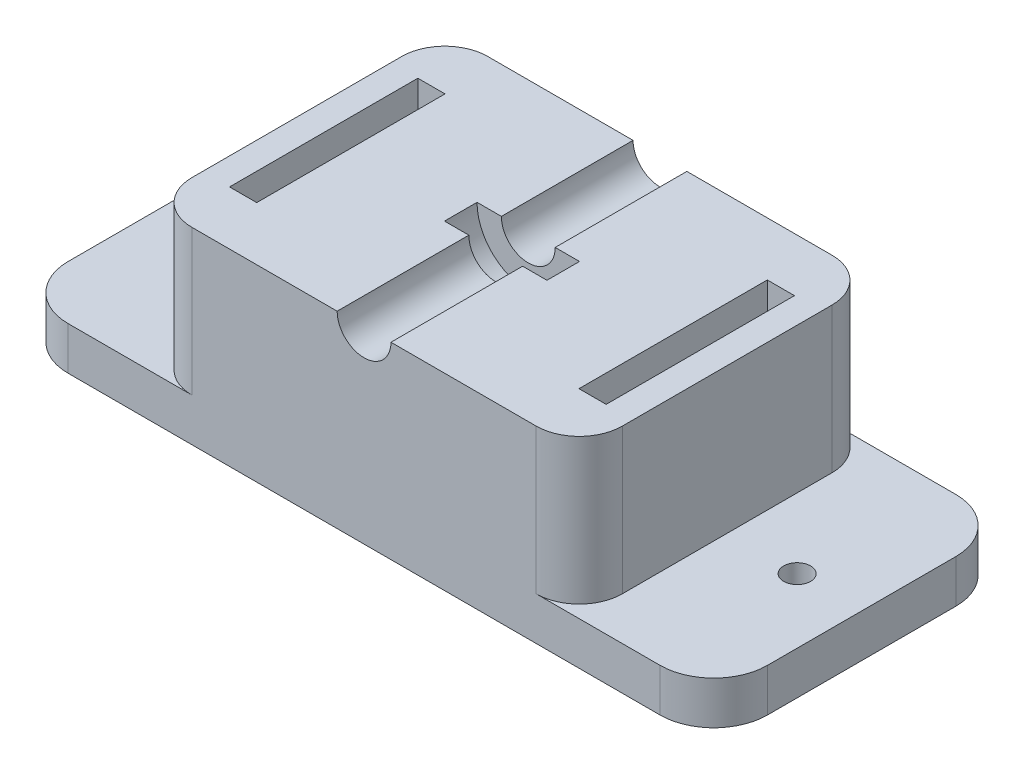
ISO-10303-21;
HEADER;
FILE_DESCRIPTION(('STEP AP214'),'2;1');
FILE_NAME('part.step','',(''),(''),'','','');
FILE_SCHEMA(('AUTOMOTIVE_DESIGN { 1 0 10303 214 1 1 1 1 }'));
ENDSEC;
DATA;
#1=APPLICATION_CONTEXT('core data for automotive mechanical design processes');
#2=APPLICATION_PROTOCOL_DEFINITION('international standard','automotive_design',2000,#1);
#3=PRODUCT_CONTEXT('',#1,'mechanical');
#4=PRODUCT('Part','Part','',(#3));
#5=PRODUCT_RELATED_PRODUCT_CATEGORY('part','',(#4));
#6=PRODUCT_DEFINITION_FORMATION('','',#4);
#7=PRODUCT_DEFINITION_CONTEXT('part definition',#1,'design');
#8=PRODUCT_DEFINITION('design','',#6,#7);
#9=PRODUCT_DEFINITION_SHAPE('','',#8);
#10=(LENGTH_UNIT() NAMED_UNIT(*) SI_UNIT(.MILLI.,.METRE.));
#11=(NAMED_UNIT(*) PLANE_ANGLE_UNIT() SI_UNIT($,.RADIAN.));
#12=(NAMED_UNIT(*) SI_UNIT($,.STERADIAN.) SOLID_ANGLE_UNIT());
#13=UNCERTAINTY_MEASURE_WITH_UNIT(LENGTH_MEASURE(1.E-05),#10,'distance_accuracy_value','');
#14=(GEOMETRIC_REPRESENTATION_CONTEXT(3) GLOBAL_UNCERTAINTY_ASSIGNED_CONTEXT((#13)) GLOBAL_UNIT_ASSIGNED_CONTEXT((#10,
#11,#12)) REPRESENTATION_CONTEXT('',''));
#15=CARTESIAN_POINT('',(0.,0.,0.));
#16=DIRECTION('',(0.,0.,1.));
#17=DIRECTION('',(1.,0.,0.));
#18=AXIS2_PLACEMENT_3D('',#15,#16,#17);
#19=CARTESIAN_POINT('',(-40.,0.,55.));
#20=DIRECTION('',(0.,-1.,0.));
#21=DIRECTION('',(0.,0.,-1.));
#22=AXIS2_PLACEMENT_3D('',#19,#20,#21);
#23=PLANE('',#22);
#24=DIRECTION('',(-1.,0.,0.));
#25=VECTOR('',#24,1.);
#26=CARTESIAN_POINT('',(35.,0.,10.));
#27=LINE('',#26,#25);
#28=CARTESIAN_POINT('',(35.,0.,10.));
#29=VERTEX_POINT('',#28);
#30=CARTESIAN_POINT('',(29.95,0.,9.99999999999997));
#31=VERTEX_POINT('',#30);
#32=EDGE_CURVE('E326',#29,#31,#27,.T.);
#33=ORIENTED_EDGE('',*,*,#32,.F.);
#34=DIRECTION('',(0.,0.,-1.));
#35=VECTOR('',#34,1.);
#36=CARTESIAN_POINT('',(35.,0.,10.));
#37=LINE('',#36,#35);
#38=CARTESIAN_POINT('',(35.,0.,45.));
#39=VERTEX_POINT('',#38);
#40=EDGE_CURVE('E258',#39,#29,#37,.T.);
#41=ORIENTED_EDGE('',*,*,#40,.F.);
#42=DIRECTION('',(1.,0.,0.));
#43=VECTOR('',#42,1.);
#44=CARTESIAN_POINT('',(35.,0.,45.));
#45=LINE('',#44,#43);
#46=CARTESIAN_POINT('',(29.95,0.,45.));
#47=VERTEX_POINT('',#46);
#48=EDGE_CURVE('E315',#47,#39,#45,.T.);
#49=ORIENTED_EDGE('',*,*,#48,.F.);
#50=DIRECTION('',(0.,0.,1.));
#51=VECTOR('',#50,1.);
#52=CARTESIAN_POINT('',(29.95,0.,9.99999999999997));
#53=LINE('',#52,#51);
#54=EDGE_CURVE('E329',#31,#47,#53,.T.);
#55=ORIENTED_EDGE('',*,*,#54,.F.);
#56=EDGE_LOOP('',(#33,#41,#49,#55));
#57=FACE_BOUND('',#56,.T.);
#58=DIRECTION('',(0.,0.,-1.));
#59=VECTOR('',#58,1.);
#60=CARTESIAN_POINT('',(40.,0.,55.));
#61=LINE('',#60,#59);
#62=CARTESIAN_POINT('',(40.,0.,47.));
#63=VERTEX_POINT('',#62);
#64=CARTESIAN_POINT('',(40.,0.,8.));
#65=VERTEX_POINT('',#64);
#66=EDGE_CURVE('E370',#63,#65,#61,.T.);
#67=ORIENTED_EDGE('',*,*,#66,.T.);
#68=CARTESIAN_POINT('',(32.,0.,8.));
#69=DIRECTION('',(0.,-1.,0.));
#70=DIRECTION('',(0.,0.,-1.));
#71=AXIS2_PLACEMENT_3D('',#68,#69,#70);
#72=CIRCLE('',#71,8.);
#73=CARTESIAN_POINT('',(32.,0.,0.));
#74=VERTEX_POINT('',#73);
#75=EDGE_CURVE('E244',#65,#74,#72,.F.);
#76=ORIENTED_EDGE('',*,*,#75,.T.);
#77=DIRECTION('',(-1.,0.,0.));
#78=VECTOR('',#77,1.);
#79=CARTESIAN_POINT('',(-40.,0.,0.));
#80=LINE('',#79,#78);
#81=CARTESIAN_POINT('',(5.,0.,0.));
#82=VERTEX_POINT('',#81);
#83=EDGE_CURVE('E238',#74,#82,#80,.T.);
#84=ORIENTED_EDGE('',*,*,#83,.T.);
#85=DIRECTION('',(0.,0.,1.));
#86=VECTOR('',#85,1.);
#87=CARTESIAN_POINT('',(5.,0.,0.));
#88=LINE('',#87,#86);
#89=CARTESIAN_POINT('',(5.,0.,24.475));
#90=VERTEX_POINT('',#89);
#91=EDGE_CURVE('E242',#82,#90,#88,.T.);
#92=ORIENTED_EDGE('',*,*,#91,.T.);
#93=DIRECTION('',(-1.,0.,0.));
#94=VECTOR('',#93,1.);
#95=CARTESIAN_POINT('',(-40.,0.,24.475));
#96=LINE('',#95,#94);
#97=CARTESIAN_POINT('',(9.525,0.,24.475));
#98=VERTEX_POINT('',#97);
#99=EDGE_CURVE('E395',#98,#90,#96,.T.);
#100=ORIENTED_EDGE('',*,*,#99,.F.);
#101=DIRECTION('',(0.,0.,1.));
#102=VECTOR('',#101,1.);
#103=CARTESIAN_POINT('',(9.525,0.,24.475));
#104=LINE('',#103,#102);
#105=CARTESIAN_POINT('',(9.525,0.,30.525));
#106=VERTEX_POINT('',#105);
#107=EDGE_CURVE('E391',#98,#106,#104,.T.);
#108=ORIENTED_EDGE('',*,*,#107,.T.);
#109=DIRECTION('',(-1.,0.,0.));
#110=VECTOR('',#109,1.);
#111=CARTESIAN_POINT('',(-40.,0.,30.525));
#112=LINE('',#111,#110);
#113=CARTESIAN_POINT('',(5.,0.,30.525));
#114=VERTEX_POINT('',#113);
#115=EDGE_CURVE('E385',#106,#114,#112,.T.);
#116=ORIENTED_EDGE('',*,*,#115,.T.);
#117=CARTESIAN_POINT('',(5.,0.,55.));
#118=VERTEX_POINT('',#117);
#119=EDGE_CURVE('E261',#114,#118,#88,.T.);
#120=ORIENTED_EDGE('',*,*,#119,.T.);
#121=DIRECTION('',(-1.,0.,0.));
#122=VECTOR('',#121,1.);
#123=CARTESIAN_POINT('',(-40.,0.,55.));
#124=LINE('',#123,#122);
#125=CARTESIAN_POINT('',(32.,0.,55.));
#126=VERTEX_POINT('',#125);
#127=EDGE_CURVE('E352',#126,#118,#124,.T.);
#128=ORIENTED_EDGE('',*,*,#127,.F.);
#129=CARTESIAN_POINT('',(32.,0.,47.));
#130=DIRECTION('',(0.,-1.,0.));
#131=DIRECTION('',(0.,0.,-1.));
#132=AXIS2_PLACEMENT_3D('',#129,#130,#131);
#133=CIRCLE('',#132,8.);
#134=EDGE_CURVE('E453',#126,#63,#133,.F.);
#135=ORIENTED_EDGE('',*,*,#134,.T.);
#136=EDGE_LOOP('',(#67,#76,#84,#92,#100,#108,#116,#120,#128,#135));
#137=FACE_BOUND('',#136,.T.);
#138=ADVANCED_FACE('F40',(#57,#137),#23,.F.);
#139=DIRECTION('',(1.,0.,0.));
#140=VECTOR('',#139,1.);
#141=CARTESIAN_POINT('',(-35.,0.,45.));
#142=LINE('',#141,#140);
#143=CARTESIAN_POINT('',(-35.,0.,45.));
#144=VERTEX_POINT('',#143);
#145=CARTESIAN_POINT('',(-29.95,0.,45.));
#146=VERTEX_POINT('',#145);
#147=EDGE_CURVE('E293',#144,#146,#142,.T.);
#148=ORIENTED_EDGE('',*,*,#147,.F.);
#149=DIRECTION('',(0.,0.,1.));
#150=VECTOR('',#149,1.);
#151=CARTESIAN_POINT('',(-35.,0.,10.));
#152=LINE('',#151,#150);
#153=CARTESIAN_POINT('',(-35.,0.,10.));
#154=VERTEX_POINT('',#153);
#155=EDGE_CURVE('E291',#154,#144,#152,.T.);
#156=ORIENTED_EDGE('',*,*,#155,.F.);
#157=DIRECTION('',(-1.,0.,0.));
#158=VECTOR('',#157,1.);
#159=CARTESIAN_POINT('',(-35.,0.,10.));
#160=LINE('',#159,#158);
#161=CARTESIAN_POINT('',(-29.95,0.,9.99999999999999));
#162=VERTEX_POINT('',#161);
#163=EDGE_CURVE('E281',#162,#154,#160,.T.);
#164=ORIENTED_EDGE('',*,*,#163,.F.);
#165=DIRECTION('',(0.,0.,-1.));
#166=VECTOR('',#165,1.);
#167=CARTESIAN_POINT('',(-29.95,0.,9.99999999999999));
#168=LINE('',#167,#166);
#169=EDGE_CURVE('E297',#146,#162,#168,.T.);
#170=ORIENTED_EDGE('',*,*,#169,.F.);
#171=EDGE_LOOP('',(#148,#156,#164,#170));
#172=FACE_BOUND('',#171,.T.);
#173=CARTESIAN_POINT('',(-5.,0.,0.));
#174=VERTEX_POINT('',#173);
#175=CARTESIAN_POINT('',(-32.,0.,0.));
#176=VERTEX_POINT('',#175);
#177=EDGE_CURVE('E250',#174,#176,#80,.T.);
#178=ORIENTED_EDGE('',*,*,#177,.T.);
#179=CARTESIAN_POINT('',(-32.,0.,8.));
#180=DIRECTION('',(0.,-1.,0.));
#181=DIRECTION('',(0.,0.,-1.));
#182=AXIS2_PLACEMENT_3D('',#179,#180,#181);
#183=CIRCLE('',#182,8.);
#184=CARTESIAN_POINT('',(-40.,0.,8.));
#185=VERTEX_POINT('',#184);
#186=EDGE_CURVE('E446',#176,#185,#183,.F.);
#187=ORIENTED_EDGE('',*,*,#186,.T.);
#188=DIRECTION('',(0.,0.,-1.));
#189=VECTOR('',#188,1.);
#190=CARTESIAN_POINT('',(-40.,0.,55.));
#191=LINE('',#190,#189);
#192=CARTESIAN_POINT('',(-40.,0.,47.));
#193=VERTEX_POINT('',#192);
#194=EDGE_CURVE('E367',#193,#185,#191,.T.);
#195=ORIENTED_EDGE('',*,*,#194,.F.);
#196=CARTESIAN_POINT('',(-32.,0.,47.));
#197=DIRECTION('',(0.,-1.,0.));
#198=DIRECTION('',(0.,0.,-1.));
#199=AXIS2_PLACEMENT_3D('',#196,#197,#198);
#200=CIRCLE('',#199,8.);
#201=CARTESIAN_POINT('',(-32.,0.,55.));
#202=VERTEX_POINT('',#201);
#203=EDGE_CURVE('E444',#193,#202,#200,.F.);
#204=ORIENTED_EDGE('',*,*,#203,.T.);
#205=CARTESIAN_POINT('',(-5.,0.,55.));
#206=VERTEX_POINT('',#205);
#207=EDGE_CURVE('E351',#206,#202,#124,.T.);
#208=ORIENTED_EDGE('',*,*,#207,.F.);
#209=DIRECTION('',(0.,0.,1.));
#210=VECTOR('',#209,1.);
#211=CARTESIAN_POINT('',(-5.,0.,0.));
#212=LINE('',#211,#210);
#213=CARTESIAN_POINT('',(-5.,0.,30.525));
#214=VERTEX_POINT('',#213);
#215=EDGE_CURVE('E265',#206,#214,#212,.F.);
#216=ORIENTED_EDGE('',*,*,#215,.T.);
#217=CARTESIAN_POINT('',(-9.525,0.,30.525));
#218=VERTEX_POINT('',#217);
#219=EDGE_CURVE('E384',#214,#218,#112,.T.);
#220=ORIENTED_EDGE('',*,*,#219,.T.);
#221=DIRECTION('',(0.,0.,1.));
#222=VECTOR('',#221,1.);
#223=CARTESIAN_POINT('',(-9.525,0.,24.475));
#224=LINE('',#223,#222);
#225=CARTESIAN_POINT('',(-9.525,0.,24.475));
#226=VERTEX_POINT('',#225);
#227=EDGE_CURVE('E388',#218,#226,#224,.F.);
#228=ORIENTED_EDGE('',*,*,#227,.T.);
#229=CARTESIAN_POINT('',(-5.,0.,24.475));
#230=VERTEX_POINT('',#229);
#231=EDGE_CURVE('E394',#230,#226,#96,.T.);
#232=ORIENTED_EDGE('',*,*,#231,.F.);
#233=EDGE_CURVE('E259',#230,#174,#212,.F.);
#234=ORIENTED_EDGE('',*,*,#233,.T.);
#235=EDGE_LOOP('',(#178,#187,#195,#204,#208,#216,#220,#228,#232,#234));
#236=FACE_BOUND('',#235,.T.);
#237=ADVANCED_FACE('F485',(#172,#236),#23,.F.);
#238=CARTESIAN_POINT('',(-65.,-35.,55.));
#239=DIRECTION('',(1.,0.,0.));
#240=DIRECTION('',(0.,0.,-1.));
#241=AXIS2_PLACEMENT_3D('',#238,#239,#240);
#242=PLANE('',#241);
#243=DIRECTION('',(0.,0.,-1.));
#244=VECTOR('',#243,1.);
#245=CARTESIAN_POINT('',(-65.,-27.,55.));
#246=LINE('',#245,#244);
#247=CARTESIAN_POINT('',(-65.,-27.,45.));
#248=VERTEX_POINT('',#247);
#249=CARTESIAN_POINT('',(-65.,-27.,10.));
#250=VERTEX_POINT('',#249);
#251=EDGE_CURVE('E355',#248,#250,#246,.T.);
#252=ORIENTED_EDGE('',*,*,#251,.T.);
#253=DIRECTION('',(0.,-1.,0.));
#254=VECTOR('',#253,1.);
#255=CARTESIAN_POINT('',(-65.,-35.,10.));
#256=LINE('',#255,#254);
#257=CARTESIAN_POINT('',(-65.,-35.,10.));
#258=VERTEX_POINT('',#257);
#259=EDGE_CURVE('E428',#250,#258,#256,.T.);
#260=ORIENTED_EDGE('',*,*,#259,.T.);
#261=DIRECTION('',(0.,0.,-1.));
#262=VECTOR('',#261,1.);
#263=CARTESIAN_POINT('',(-65.,-35.,55.));
#264=LINE('',#263,#262);
#265=CARTESIAN_POINT('',(-65.,-35.,45.));
#266=VERTEX_POINT('',#265);
#267=EDGE_CURVE('E381',#266,#258,#264,.T.);
#268=ORIENTED_EDGE('',*,*,#267,.F.);
#269=DIRECTION('',(0.,-1.,0.));
#270=VECTOR('',#269,1.);
#271=CARTESIAN_POINT('',(-65.,-27.,45.));
#272=LINE('',#271,#270);
#273=EDGE_CURVE('E426',#266,#248,#272,.F.);
#274=ORIENTED_EDGE('',*,*,#273,.T.);
#275=EDGE_LOOP('',(#252,#260,#268,#274));
#276=FACE_BOUND('',#275,.T.);
#277=ADVANCED_FACE('F511',(#276),#242,.F.);
#278=CARTESIAN_POINT('',(40.,-35.,55.));
#279=DIRECTION('',(0.,1.,0.));
#280=DIRECTION('',(0.,0.,1.));
#281=AXIS2_PLACEMENT_3D('',#278,#279,#280);
#282=PLANE('',#281);
#283=CARTESIAN_POINT('',(-53.,-35.,27.5));
#284=DIRECTION('',(0.,1.,0.));
#285=DIRECTION('',(0.,0.,1.));
#286=AXIS2_PLACEMENT_3D('',#283,#284,#285);
#287=CIRCLE('',#286,2.5);
#288=CARTESIAN_POINT('',(-53.,-35.,30.));
#289=VERTEX_POINT('',#288);
#290=EDGE_CURVE('E271',#289,#289,#287,.T.);
#291=ORIENTED_EDGE('',*,*,#290,.T.);
#292=EDGE_LOOP('',(#291));
#293=FACE_BOUND('',#292,.T.);
#294=CARTESIAN_POINT('',(53.,-35.,27.5));
#295=DIRECTION('',(0.,1.,0.));
#296=DIRECTION('',(0.,0.,-1.));
#297=AXIS2_PLACEMENT_3D('',#294,#295,#296);
#298=CIRCLE('',#297,2.5);
#299=CARTESIAN_POINT('',(53.,-35.,25.));
#300=VERTEX_POINT('',#299);
#301=EDGE_CURVE('E636',#300,#300,#298,.T.);
#302=ORIENTED_EDGE('',*,*,#301,.T.);
#303=EDGE_LOOP('',(#302));
#304=FACE_BOUND('',#303,.T.);
#305=DIRECTION('',(1.,0.,0.));
#306=VECTOR('',#305,1.);
#307=CARTESIAN_POINT('',(40.,-35.,0.));
#308=LINE('',#307,#306);
#309=CARTESIAN_POINT('',(-55.,-35.,0.));
#310=VERTEX_POINT('',#309);
#311=CARTESIAN_POINT('',(55.,-35.,0.));
#312=VERTEX_POINT('',#311);
#313=EDGE_CURVE('E344',#310,#312,#308,.T.);
#314=ORIENTED_EDGE('',*,*,#313,.T.);
#315=CARTESIAN_POINT('',(55.,-35.,10.));
#316=DIRECTION('',(0.,1.,0.));
#317=DIRECTION('',(0.,0.,1.));
#318=AXIS2_PLACEMENT_3D('',#315,#316,#317);
#319=CIRCLE('',#318,10.);
#320=CARTESIAN_POINT('',(65.,-35.,10.));
#321=VERTEX_POINT('',#320);
#322=EDGE_CURVE('E419',#312,#321,#319,.F.);
#323=ORIENTED_EDGE('',*,*,#322,.T.);
#324=DIRECTION('',(0.,0.,-1.));
#325=VECTOR('',#324,1.);
#326=CARTESIAN_POINT('',(65.,-35.,55.));
#327=LINE('',#326,#325);
#328=CARTESIAN_POINT('',(65.,-35.,45.));
#329=VERTEX_POINT('',#328);
#330=EDGE_CURVE('E378',#329,#321,#327,.T.);
#331=ORIENTED_EDGE('',*,*,#330,.F.);
#332=CARTESIAN_POINT('',(55.,-35.,45.));
#333=DIRECTION('',(0.,1.,0.));
#334=DIRECTION('',(0.,0.,1.));
#335=AXIS2_PLACEMENT_3D('',#332,#333,#334);
#336=CIRCLE('',#335,10.);
#337=CARTESIAN_POINT('',(55.,-35.,55.));
#338=VERTEX_POINT('',#337);
#339=EDGE_CURVE('E417',#329,#338,#336,.F.);
#340=ORIENTED_EDGE('',*,*,#339,.T.);
#341=DIRECTION('',(1.,0.,0.));
#342=VECTOR('',#341,1.);
#343=CARTESIAN_POINT('',(-40.,-35.,55.));
#344=LINE('',#343,#342);
#345=CARTESIAN_POINT('',(-55.,-35.,55.));
#346=VERTEX_POINT('',#345);
#347=EDGE_CURVE('E347',#346,#338,#344,.T.);
#348=ORIENTED_EDGE('',*,*,#347,.F.);
#349=CARTESIAN_POINT('',(-55.,-35.,45.));
#350=DIRECTION('',(0.,1.,0.));
#351=DIRECTION('',(0.,0.,1.));
#352=AXIS2_PLACEMENT_3D('',#349,#350,#351);
#353=CIRCLE('',#352,10.);
#354=EDGE_CURVE('E413',#346,#266,#353,.F.);
#355=ORIENTED_EDGE('',*,*,#354,.T.);
#356=ORIENTED_EDGE('',*,*,#267,.T.);
#357=CARTESIAN_POINT('',(-55.,-35.,10.));
#358=DIRECTION('',(0.,1.,0.));
#359=DIRECTION('',(0.,0.,1.));
#360=AXIS2_PLACEMENT_3D('',#357,#358,#359);
#361=CIRCLE('',#360,10.);
#362=EDGE_CURVE('E415',#258,#310,#361,.F.);
#363=ORIENTED_EDGE('',*,*,#362,.T.);
#364=EDGE_LOOP('',(#314,#323,#331,#340,#348,#355,#356,#363));
#365=FACE_BOUND('',#364,.T.);
#366=ADVANCED_FACE('F514',(#293,#304,#365),#282,.F.);
#367=CARTESIAN_POINT('',(65.,-35.,55.));
#368=DIRECTION('',(-1.,0.,0.));
#369=DIRECTION('',(0.,-1.,0.));
#370=AXIS2_PLACEMENT_3D('',#367,#368,#369);
#371=PLANE('',#370);
#372=ORIENTED_EDGE('',*,*,#330,.T.);
#373=DIRECTION('',(0.,1.,0.));
#374=VECTOR('',#373,1.);
#375=CARTESIAN_POINT('',(65.,-35.,10.));
#376=LINE('',#375,#374);
#377=CARTESIAN_POINT('',(65.,-27.,10.));
#378=VERTEX_POINT('',#377);
#379=EDGE_CURVE('E402',#321,#378,#376,.T.);
#380=ORIENTED_EDGE('',*,*,#379,.T.);
#381=DIRECTION('',(0.,0.,-1.));
#382=VECTOR('',#381,1.);
#383=CARTESIAN_POINT('',(65.,-27.,55.));
#384=LINE('',#383,#382);
#385=CARTESIAN_POINT('',(65.,-27.,45.));
#386=VERTEX_POINT('',#385);
#387=EDGE_CURVE('E375',#386,#378,#384,.T.);
#388=ORIENTED_EDGE('',*,*,#387,.F.);
#389=DIRECTION('',(0.,1.,0.));
#390=VECTOR('',#389,1.);
#391=CARTESIAN_POINT('',(65.,-35.,45.));
#392=LINE('',#391,#390);
#393=EDGE_CURVE('E400',#386,#329,#392,.F.);
#394=ORIENTED_EDGE('',*,*,#393,.T.);
#395=EDGE_LOOP('',(#372,#380,#388,#394));
#396=FACE_BOUND('',#395,.T.);
#397=ADVANCED_FACE('F528',(#396),#371,.F.);
#398=CARTESIAN_POINT('',(40.,-27.,55.));
#399=DIRECTION('',(0.,-1.,0.));
#400=DIRECTION('',(1.,0.,0.));
#401=AXIS2_PLACEMENT_3D('',#398,#399,#400);
#402=PLANE('',#401);
#403=CARTESIAN_POINT('',(53.,-27.,27.5));
#404=DIRECTION('',(0.,1.,0.));
#405=DIRECTION('',(0.,0.,-1.));
#406=AXIS2_PLACEMENT_3D('',#403,#404,#405);
#407=CIRCLE('',#406,2.5);
#408=CARTESIAN_POINT('',(53.,-27.,25.));
#409=VERTEX_POINT('',#408);
#410=EDGE_CURVE('E640',#409,#409,#407,.T.);
#411=ORIENTED_EDGE('',*,*,#410,.F.);
#412=EDGE_LOOP('',(#411));
#413=FACE_BOUND('',#412,.T.);
#414=ORIENTED_EDGE('',*,*,#387,.T.);
#415=CARTESIAN_POINT('',(55.,-27.,10.));
#416=DIRECTION('',(0.,-1.,0.));
#417=DIRECTION('',(1.,0.,0.));
#418=AXIS2_PLACEMENT_3D('',#415,#416,#417);
#419=CIRCLE('',#418,10.);
#420=CARTESIAN_POINT('',(55.,-27.,0.));
#421=VERTEX_POINT('',#420);
#422=EDGE_CURVE('E407',#378,#421,#419,.F.);
#423=ORIENTED_EDGE('',*,*,#422,.T.);
#424=DIRECTION('',(-1.,0.,0.));
#425=VECTOR('',#424,1.);
#426=CARTESIAN_POINT('',(40.,-27.,0.));
#427=LINE('',#426,#425);
#428=CARTESIAN_POINT('',(32.,-27.,0.));
#429=VERTEX_POINT('',#428);
#430=EDGE_CURVE('E358',#421,#429,#427,.T.);
#431=ORIENTED_EDGE('',*,*,#430,.T.);
#432=CARTESIAN_POINT('',(32.,-27.,8.));
#433=DIRECTION('',(0.,-1.,0.));
#434=DIRECTION('',(1.,0.,0.));
#435=AXIS2_PLACEMENT_3D('',#432,#433,#434);
#436=CIRCLE('',#435,8.);
#437=CARTESIAN_POINT('',(40.,-27.,8.));
#438=VERTEX_POINT('',#437);
#439=EDGE_CURVE('E464',#429,#438,#436,.T.);
#440=ORIENTED_EDGE('',*,*,#439,.T.);
#441=DIRECTION('',(0.,0.,-1.));
#442=VECTOR('',#441,1.);
#443=CARTESIAN_POINT('',(40.,-27.,55.));
#444=LINE('',#443,#442);
#445=CARTESIAN_POINT('',(40.,-27.,47.));
#446=VERTEX_POINT('',#445);
#447=EDGE_CURVE('E372',#446,#438,#444,.T.);
#448=ORIENTED_EDGE('',*,*,#447,.F.);
#449=CARTESIAN_POINT('',(32.,-27.,47.));
#450=DIRECTION('',(0.,-1.,0.));
#451=DIRECTION('',(1.,0.,0.));
#452=AXIS2_PLACEMENT_3D('',#449,#450,#451);
#453=CIRCLE('',#452,8.);
#454=CARTESIAN_POINT('',(32.,-27.,55.));
#455=VERTEX_POINT('',#454);
#456=EDGE_CURVE('E48',#446,#455,#453,.T.);
#457=ORIENTED_EDGE('',*,*,#456,.T.);
#458=DIRECTION('',(-1.,0.,0.));
#459=VECTOR('',#458,1.);
#460=CARTESIAN_POINT('',(40.,-27.,55.));
#461=LINE('',#460,#459);
#462=CARTESIAN_POINT('',(55.,-27.,55.));
#463=VERTEX_POINT('',#462);
#464=EDGE_CURVE('E55',#463,#455,#461,.T.);
#465=ORIENTED_EDGE('',*,*,#464,.F.);
#466=CARTESIAN_POINT('',(55.,-27.,45.));
#467=DIRECTION('',(0.,-1.,0.));
#468=DIRECTION('',(1.,0.,0.));
#469=AXIS2_PLACEMENT_3D('',#466,#467,#468);
#470=CIRCLE('',#469,10.);
#471=EDGE_CURVE('E405',#463,#386,#470,.F.);
#472=ORIENTED_EDGE('',*,*,#471,.T.);
#473=EDGE_LOOP('',(#414,#423,#431,#440,#448,#457,#465,#472));
#474=FACE_BOUND('',#473,.T.);
#475=ADVANCED_FACE('F469',(#413,#474),#402,.F.);
#476=CARTESIAN_POINT('',(40.,0.,55.));
#477=DIRECTION('',(-1.,0.,0.));
#478=DIRECTION('',(0.,-1.,0.));
#479=AXIS2_PLACEMENT_3D('',#476,#477,#478);
#480=PLANE('',#479);
#481=ORIENTED_EDGE('',*,*,#447,.T.);
#482=DIRECTION('',(0.,1.,0.));
#483=VECTOR('',#482,1.);
#484=CARTESIAN_POINT('',(40.,0.,8.));
#485=LINE('',#484,#483);
#486=EDGE_CURVE('E450',#438,#65,#485,.T.);
#487=ORIENTED_EDGE('',*,*,#486,.T.);
#488=ORIENTED_EDGE('',*,*,#66,.F.);
#489=DIRECTION('',(0.,1.,0.));
#490=VECTOR('',#489,1.);
#491=CARTESIAN_POINT('',(40.,-27.,47.));
#492=LINE('',#491,#490);
#493=EDGE_CURVE('E448',#63,#446,#492,.F.);
#494=ORIENTED_EDGE('',*,*,#493,.T.);
#495=EDGE_LOOP('',(#481,#487,#488,#494));
#496=FACE_BOUND('',#495,.T.);
#497=ADVANCED_FACE('F541',(#496),#480,.F.);
#498=CARTESIAN_POINT('',(-40.,-27.,55.));
#499=DIRECTION('',(1.,0.,0.));
#500=DIRECTION('',(0.,0.,-1.));
#501=AXIS2_PLACEMENT_3D('',#498,#499,#500);
#502=PLANE('',#501);
#503=ORIENTED_EDGE('',*,*,#194,.T.);
#504=DIRECTION('',(0.,-1.,0.));
#505=VECTOR('',#504,1.);
#506=CARTESIAN_POINT('',(-40.,-27.,8.));
#507=LINE('',#506,#505);
#508=CARTESIAN_POINT('',(-40.,-27.,8.));
#509=VERTEX_POINT('',#508);
#510=EDGE_CURVE('E437',#185,#509,#507,.T.);
#511=ORIENTED_EDGE('',*,*,#510,.T.);
#512=DIRECTION('',(0.,0.,-1.));
#513=VECTOR('',#512,1.);
#514=CARTESIAN_POINT('',(-40.,-27.,55.));
#515=LINE('',#514,#513);
#516=CARTESIAN_POINT('',(-40.,-27.,47.));
#517=VERTEX_POINT('',#516);
#518=EDGE_CURVE('E364',#517,#509,#515,.T.);
#519=ORIENTED_EDGE('',*,*,#518,.F.);
#520=DIRECTION('',(0.,-1.,0.));
#521=VECTOR('',#520,1.);
#522=CARTESIAN_POINT('',(-40.,0.,47.));
#523=LINE('',#522,#521);
#524=EDGE_CURVE('E435',#517,#193,#523,.F.);
#525=ORIENTED_EDGE('',*,*,#524,.T.);
#526=EDGE_LOOP('',(#503,#511,#519,#525));
#527=FACE_BOUND('',#526,.T.);
#528=ADVANCED_FACE('F496',(#527),#502,.F.);
#529=CARTESIAN_POINT('',(-40.,-27.,55.));
#530=DIRECTION('',(0.,-1.,0.));
#531=DIRECTION('',(0.,0.,-1.));
#532=AXIS2_PLACEMENT_3D('',#529,#530,#531);
#533=PLANE('',#532);
#534=CARTESIAN_POINT('',(-53.,-27.,27.5));
#535=DIRECTION('',(0.,1.,0.));
#536=DIRECTION('',(0.,0.,1.));
#537=AXIS2_PLACEMENT_3D('',#534,#535,#536);
#538=CIRCLE('',#537,2.5);
#539=CARTESIAN_POINT('',(-53.,-27.,30.));
#540=VERTEX_POINT('',#539);
#541=EDGE_CURVE('E635',#540,#540,#538,.T.);
#542=ORIENTED_EDGE('',*,*,#541,.F.);
#543=EDGE_LOOP('',(#542));
#544=FACE_BOUND('',#543,.T.);
#545=DIRECTION('',(-1.,0.,0.));
#546=VECTOR('',#545,1.);
#547=CARTESIAN_POINT('',(-40.,-27.,0.));
#548=LINE('',#547,#546);
#549=CARTESIAN_POINT('',(-32.,-27.,0.));
#550=VERTEX_POINT('',#549);
#551=CARTESIAN_POINT('',(-55.,-27.,0.));
#552=VERTEX_POINT('',#551);
#553=EDGE_CURVE('E249',#550,#552,#548,.T.);
#554=ORIENTED_EDGE('',*,*,#553,.T.);
#555=CARTESIAN_POINT('',(-55.,-27.,10.));
#556=DIRECTION('',(0.,-1.,0.));
#557=DIRECTION('',(0.,0.,-1.));
#558=AXIS2_PLACEMENT_3D('',#555,#556,#557);
#559=CIRCLE('',#558,10.);
#560=EDGE_CURVE('E433',#552,#250,#559,.F.);
#561=ORIENTED_EDGE('',*,*,#560,.T.);
#562=ORIENTED_EDGE('',*,*,#251,.F.);
#563=CARTESIAN_POINT('',(-55.,-27.,45.));
#564=DIRECTION('',(0.,-1.,0.));
#565=DIRECTION('',(0.,0.,-1.));
#566=AXIS2_PLACEMENT_3D('',#563,#564,#565);
#567=CIRCLE('',#566,10.);
#568=CARTESIAN_POINT('',(-55.,-27.,55.));
#569=VERTEX_POINT('',#568);
#570=EDGE_CURVE('E431',#248,#569,#567,.F.);
#571=ORIENTED_EDGE('',*,*,#570,.T.);
#572=DIRECTION('',(-1.,0.,0.));
#573=VECTOR('',#572,1.);
#574=CARTESIAN_POINT('',(-40.,-27.,55.));
#575=LINE('',#574,#573);
#576=CARTESIAN_POINT('',(-32.,-27.,55.));
#577=VERTEX_POINT('',#576);
#578=EDGE_CURVE('E62',#577,#569,#575,.T.);
#579=ORIENTED_EDGE('',*,*,#578,.F.);
#580=CARTESIAN_POINT('',(-32.,-27.,47.));
#581=DIRECTION('',(0.,-1.,0.));
#582=DIRECTION('',(0.,0.,-1.));
#583=AXIS2_PLACEMENT_3D('',#580,#581,#582);
#584=CIRCLE('',#583,8.);
#585=EDGE_CURVE('E11',#577,#517,#584,.T.);
#586=ORIENTED_EDGE('',*,*,#585,.T.);
#587=ORIENTED_EDGE('',*,*,#518,.T.);
#588=CARTESIAN_POINT('',(-32.,-27.,8.));
#589=DIRECTION('',(0.,-1.,0.));
#590=DIRECTION('',(0.,0.,-1.));
#591=AXIS2_PLACEMENT_3D('',#588,#589,#590);
#592=CIRCLE('',#591,8.);
#593=EDGE_CURVE('E461',#509,#550,#592,.T.);
#594=ORIENTED_EDGE('',*,*,#593,.T.);
#595=EDGE_LOOP('',(#554,#561,#562,#571,#579,#586,#587,#594));
#596=FACE_BOUND('',#595,.T.);
#597=ADVANCED_FACE('F494',(#544,#596),#533,.F.);
#598=CARTESIAN_POINT('',(0.,0.,55.));
#599=DIRECTION('',(0.,0.,1.));
#600=DIRECTION('',(1.,0.,0.));
#601=AXIS2_PLACEMENT_3D('',#598,#599,#600);
#602=PLANE('',#601);
#603=ORIENTED_EDGE('',*,*,#464,.T.);
#604=DIRECTION('',(0.,1.,0.));
#605=VECTOR('',#604,1.);
#606=CARTESIAN_POINT('',(32.,0.,55.));
#607=LINE('',#606,#605);
#608=EDGE_CURVE('E459',#455,#126,#607,.T.);
#609=ORIENTED_EDGE('',*,*,#608,.T.);
#610=ORIENTED_EDGE('',*,*,#127,.T.);
#611=CARTESIAN_POINT('',(0.,0.,55.));
#612=DIRECTION('',(0.,0.,1.));
#613=DIRECTION('',(1.,0.,0.));
#614=AXIS2_PLACEMENT_3D('',#611,#612,#613);
#615=CIRCLE('',#614,5.);
#616=EDGE_CURVE('E266',#206,#118,#615,.T.);
#617=ORIENTED_EDGE('',*,*,#616,.F.);
#618=ORIENTED_EDGE('',*,*,#207,.T.);
#619=DIRECTION('',(0.,-1.,0.));
#620=VECTOR('',#619,1.);
#621=CARTESIAN_POINT('',(-32.,-27.,55.));
#622=LINE('',#621,#620);
#623=EDGE_CURVE('E456',#202,#577,#622,.T.);
#624=ORIENTED_EDGE('',*,*,#623,.T.);
#625=ORIENTED_EDGE('',*,*,#578,.T.);
#626=DIRECTION('',(0.,-1.,0.));
#627=VECTOR('',#626,1.);
#628=CARTESIAN_POINT('',(-55.,-35.,55.));
#629=LINE('',#628,#627);
#630=EDGE_CURVE('E421',#569,#346,#629,.T.);
#631=ORIENTED_EDGE('',*,*,#630,.T.);
#632=ORIENTED_EDGE('',*,*,#347,.T.);
#633=DIRECTION('',(0.,1.,0.));
#634=VECTOR('',#633,1.);
#635=CARTESIAN_POINT('',(55.,-27.,55.));
#636=LINE('',#635,#634);
#637=EDGE_CURVE('E424',#338,#463,#636,.T.);
#638=ORIENTED_EDGE('',*,*,#637,.T.);
#639=EDGE_LOOP('',(#603,#609,#610,#617,#618,#624,#625,#631,#632,#638));
#640=FACE_BOUND('',#639,.T.);
#641=ADVANCED_FACE('F474',(#640),#602,.T.);
#642=CARTESIAN_POINT('',(0.,0.,0.));
#643=DIRECTION('',(0.,0.,1.));
#644=DIRECTION('',(1.,0.,0.));
#645=AXIS2_PLACEMENT_3D('',#642,#643,#644);
#646=PLANE('',#645);
#647=ORIENTED_EDGE('',*,*,#553,.F.);
#648=DIRECTION('',(0.,-1.,0.));
#649=VECTOR('',#648,1.);
#650=CARTESIAN_POINT('',(-32.,0.,0.));
#651=LINE('',#650,#649);
#652=EDGE_CURVE('E442',#550,#176,#651,.F.);
#653=ORIENTED_EDGE('',*,*,#652,.T.);
#654=ORIENTED_EDGE('',*,*,#177,.F.);
#655=CARTESIAN_POINT('',(0.,0.,0.));
#656=DIRECTION('',(0.,0.,1.));
#657=DIRECTION('',(1.,0.,0.));
#658=AXIS2_PLACEMENT_3D('',#655,#656,#657);
#659=CIRCLE('',#658,5.);
#660=EDGE_CURVE('E254',#174,#82,#659,.T.);
#661=ORIENTED_EDGE('',*,*,#660,.T.);
#662=ORIENTED_EDGE('',*,*,#83,.F.);
#663=DIRECTION('',(0.,1.,0.));
#664=VECTOR('',#663,1.);
#665=CARTESIAN_POINT('',(32.,0.,0.));
#666=LINE('',#665,#664);
#667=EDGE_CURVE('E440',#74,#429,#666,.F.);
#668=ORIENTED_EDGE('',*,*,#667,.T.);
#669=ORIENTED_EDGE('',*,*,#430,.F.);
#670=DIRECTION('',(0.,1.,0.));
#671=VECTOR('',#670,1.);
#672=CARTESIAN_POINT('',(55.0000000000001,0.,0.));
#673=LINE('',#672,#671);
#674=EDGE_CURVE('E411',#421,#312,#673,.F.);
#675=ORIENTED_EDGE('',*,*,#674,.T.);
#676=ORIENTED_EDGE('',*,*,#313,.F.);
#677=DIRECTION('',(0.,-1.,0.));
#678=VECTOR('',#677,1.);
#679=CARTESIAN_POINT('',(-55.,0.,0.));
#680=LINE('',#679,#678);
#681=EDGE_CURVE('E409',#310,#552,#680,.F.);
#682=ORIENTED_EDGE('',*,*,#681,.T.);
#683=EDGE_LOOP('',(#647,#653,#654,#661,#662,#668,#669,#675,#676,#682));
#684=FACE_BOUND('',#683,.T.);
#685=ADVANCED_FACE('F263',(#684),#646,.F.);
#686=CARTESIAN_POINT('',(0.,0.,24.475));
#687=DIRECTION('',(0.,0.,1.));
#688=DIRECTION('',(1.,0.,0.));
#689=AXIS2_PLACEMENT_3D('',#686,#687,#688);
#690=CYLINDRICAL_SURFACE('',#689,9.525);
#691=CARTESIAN_POINT('',(0.,0.,24.475));
#692=DIRECTION('',(0.,0.,1.));
#693=DIRECTION('',(1.,0.,0.));
#694=AXIS2_PLACEMENT_3D('',#691,#692,#693);
#695=CIRCLE('',#694,9.525);
#696=EDGE_CURVE('E341',#226,#98,#695,.T.);
#697=ORIENTED_EDGE('',*,*,#696,.F.);
#698=ORIENTED_EDGE('',*,*,#227,.F.);
#699=CARTESIAN_POINT('',(0.,0.,30.525));
#700=DIRECTION('',(0.,0.,1.));
#701=DIRECTION('',(1.,0.,0.));
#702=AXIS2_PLACEMENT_3D('',#699,#700,#701);
#703=CIRCLE('',#702,9.525);
#704=EDGE_CURVE('E304',#218,#106,#703,.T.);
#705=ORIENTED_EDGE('',*,*,#704,.T.);
#706=ORIENTED_EDGE('',*,*,#107,.F.);
#707=EDGE_LOOP('',(#697,#698,#705,#706));
#708=FACE_BOUND('',#707,.T.);
#709=ADVANCED_FACE('F565',(#708),#690,.F.);
#710=CARTESIAN_POINT('',(0.,0.,24.475));
#711=DIRECTION('',(0.,0.,1.));
#712=DIRECTION('',(1.,0.,0.));
#713=AXIS2_PLACEMENT_3D('',#710,#711,#712);
#714=PLANE('',#713);
#715=CARTESIAN_POINT('',(0.,0.,24.475));
#716=DIRECTION('',(0.,0.,1.));
#717=DIRECTION('',(1.,0.,0.));
#718=AXIS2_PLACEMENT_3D('',#715,#716,#717);
#719=CIRCLE('',#718,5.);
#720=EDGE_CURVE('E257',#230,#90,#719,.T.);
#721=ORIENTED_EDGE('',*,*,#720,.F.);
#722=ORIENTED_EDGE('',*,*,#231,.T.);
#723=ORIENTED_EDGE('',*,*,#696,.T.);
#724=ORIENTED_EDGE('',*,*,#99,.T.);
#725=EDGE_LOOP('',(#721,#722,#723,#724));
#726=FACE_BOUND('',#725,.T.);
#727=ADVANCED_FACE('F570',(#726),#714,.T.);
#728=CARTESIAN_POINT('',(0.,0.,30.525));
#729=DIRECTION('',(0.,0.,1.));
#730=DIRECTION('',(1.,0.,0.));
#731=AXIS2_PLACEMENT_3D('',#728,#729,#730);
#732=PLANE('',#731);
#733=ORIENTED_EDGE('',*,*,#219,.F.);
#734=CARTESIAN_POINT('',(0.,0.,30.525));
#735=DIRECTION('',(0.,0.,1.));
#736=DIRECTION('',(1.,0.,0.));
#737=AXIS2_PLACEMENT_3D('',#734,#735,#736);
#738=CIRCLE('',#737,5.);
#739=EDGE_CURVE('E397',#214,#114,#738,.T.);
#740=ORIENTED_EDGE('',*,*,#739,.T.);
#741=ORIENTED_EDGE('',*,*,#115,.F.);
#742=ORIENTED_EDGE('',*,*,#704,.F.);
#743=EDGE_LOOP('',(#733,#740,#741,#742));
#744=FACE_BOUND('',#743,.T.);
#745=ADVANCED_FACE('F481',(#744),#732,.F.);
#746=CARTESIAN_POINT('',(35.,-10.,10.));
#747=DIRECTION('',(1.,0.,0.));
#748=DIRECTION('',(0.,0.,-1.));
#749=AXIS2_PLACEMENT_3D('',#746,#747,#748);
#750=PLANE('',#749);
#751=ORIENTED_EDGE('',*,*,#40,.T.);
#752=DIRECTION('',(0.,1.,0.));
#753=VECTOR('',#752,1.);
#754=CARTESIAN_POINT('',(35.,-10.,10.));
#755=LINE('',#754,#753);
#756=CARTESIAN_POINT('',(35.,-10.,10.));
#757=VERTEX_POINT('',#756);
#758=EDGE_CURVE('E324',#757,#29,#755,.T.);
#759=ORIENTED_EDGE('',*,*,#758,.F.);
#760=DIRECTION('',(0.,0.,-1.));
#761=VECTOR('',#760,1.);
#762=CARTESIAN_POINT('',(35.,-10.,10.));
#763=LINE('',#762,#761);
#764=CARTESIAN_POINT('',(35.,-10.,45.));
#765=VERTEX_POINT('',#764);
#766=EDGE_CURVE('E311',#765,#757,#763,.T.);
#767=ORIENTED_EDGE('',*,*,#766,.F.);
#768=DIRECTION('',(0.,1.,0.));
#769=VECTOR('',#768,1.);
#770=CARTESIAN_POINT('',(35.,-10.,45.));
#771=LINE('',#770,#769);
#772=EDGE_CURVE('E294',#765,#39,#771,.T.);
#773=ORIENTED_EDGE('',*,*,#772,.T.);
#774=EDGE_LOOP('',(#751,#759,#767,#773));
#775=FACE_BOUND('',#774,.T.);
#776=ADVANCED_FACE('F574',(#775),#750,.F.);
#777=CARTESIAN_POINT('',(35.,-10.,45.));
#778=DIRECTION('',(0.,0.,1.));
#779=DIRECTION('',(1.,0.,0.));
#780=AXIS2_PLACEMENT_3D('',#777,#778,#779);
#781=PLANE('',#780);
#782=ORIENTED_EDGE('',*,*,#48,.T.);
#783=ORIENTED_EDGE('',*,*,#772,.F.);
#784=DIRECTION('',(1.,0.,0.));
#785=VECTOR('',#784,1.);
#786=CARTESIAN_POINT('',(35.,-10.,45.));
#787=LINE('',#786,#785);
#788=CARTESIAN_POINT('',(29.95,-10.,45.));
#789=VERTEX_POINT('',#788);
#790=EDGE_CURVE('E321',#789,#765,#787,.T.);
#791=ORIENTED_EDGE('',*,*,#790,.F.);
#792=DIRECTION('',(0.,1.,0.));
#793=VECTOR('',#792,1.);
#794=CARTESIAN_POINT('',(29.95,-10.,45.));
#795=LINE('',#794,#793);
#796=EDGE_CURVE('E335',#789,#47,#795,.T.);
#797=ORIENTED_EDGE('',*,*,#796,.T.);
#798=EDGE_LOOP('',(#782,#783,#791,#797));
#799=FACE_BOUND('',#798,.T.);
#800=ADVANCED_FACE('F580',(#799),#781,.F.);
#801=CARTESIAN_POINT('',(29.95,-10.,9.99999999999997));
#802=DIRECTION('',(-1.,0.,0.));
#803=DIRECTION('',(0.,0.,1.));
#804=AXIS2_PLACEMENT_3D('',#801,#802,#803);
#805=PLANE('',#804);
#806=ORIENTED_EDGE('',*,*,#54,.T.);
#807=ORIENTED_EDGE('',*,*,#796,.F.);
#808=DIRECTION('',(0.,0.,1.));
#809=VECTOR('',#808,1.);
#810=CARTESIAN_POINT('',(29.95,-10.,9.99999999999997));
#811=LINE('',#810,#809);
#812=CARTESIAN_POINT('',(29.95,-10.,9.99999999999997));
#813=VERTEX_POINT('',#812);
#814=EDGE_CURVE('E318',#813,#789,#811,.T.);
#815=ORIENTED_EDGE('',*,*,#814,.F.);
#816=DIRECTION('',(0.,1.,0.));
#817=VECTOR('',#816,1.);
#818=CARTESIAN_POINT('',(29.95,-10.,9.99999999999997));
#819=LINE('',#818,#817);
#820=EDGE_CURVE('E337',#813,#31,#819,.T.);
#821=ORIENTED_EDGE('',*,*,#820,.T.);
#822=EDGE_LOOP('',(#806,#807,#815,#821));
#823=FACE_BOUND('',#822,.T.);
#824=ADVANCED_FACE('F586',(#823),#805,.F.);
#825=CARTESIAN_POINT('',(35.,-10.,10.));
#826=DIRECTION('',(0.,0.,-1.));
#827=DIRECTION('',(-1.,0.,0.));
#828=AXIS2_PLACEMENT_3D('',#825,#826,#827);
#829=PLANE('',#828);
#830=ORIENTED_EDGE('',*,*,#32,.T.);
#831=ORIENTED_EDGE('',*,*,#820,.F.);
#832=DIRECTION('',(-1.,0.,0.));
#833=VECTOR('',#832,1.);
#834=CARTESIAN_POINT('',(35.,-10.,10.));
#835=LINE('',#834,#833);
#836=EDGE_CURVE('E314',#757,#813,#835,.T.);
#837=ORIENTED_EDGE('',*,*,#836,.F.);
#838=ORIENTED_EDGE('',*,*,#758,.T.);
#839=EDGE_LOOP('',(#830,#831,#837,#838));
#840=FACE_BOUND('',#839,.T.);
#841=ADVANCED_FACE('F582',(#840),#829,.F.);
#842=CARTESIAN_POINT('',(0.,-10.,0.));
#843=DIRECTION('',(0.,-1.,0.));
#844=DIRECTION('',(0.,0.,-1.));
#845=AXIS2_PLACEMENT_3D('',#842,#843,#844);
#846=PLANE('',#845);
#847=ORIENTED_EDGE('',*,*,#766,.T.);
#848=ORIENTED_EDGE('',*,*,#836,.T.);
#849=ORIENTED_EDGE('',*,*,#814,.T.);
#850=ORIENTED_EDGE('',*,*,#790,.T.);
#851=EDGE_LOOP('',(#847,#848,#849,#850));
#852=FACE_BOUND('',#851,.T.);
#853=ADVANCED_FACE('F585',(#852),#846,.F.);
#854=CARTESIAN_POINT('',(-35.,-10.,10.));
#855=DIRECTION('',(-1.,0.,0.));
#856=DIRECTION('',(0.,0.,1.));
#857=AXIS2_PLACEMENT_3D('',#854,#855,#856);
#858=PLANE('',#857);
#859=ORIENTED_EDGE('',*,*,#155,.T.);
#860=DIRECTION('',(0.,1.,0.));
#861=VECTOR('',#860,1.);
#862=CARTESIAN_POINT('',(-35.,-10.,45.));
#863=LINE('',#862,#861);
#864=CARTESIAN_POINT('',(-35.,-10.,45.));
#865=VERTEX_POINT('',#864);
#866=EDGE_CURVE('E290',#865,#144,#863,.T.);
#867=ORIENTED_EDGE('',*,*,#866,.F.);
#868=DIRECTION('',(0.,0.,1.));
#869=VECTOR('',#868,1.);
#870=CARTESIAN_POINT('',(-35.,-10.,10.));
#871=LINE('',#870,#869);
#872=CARTESIAN_POINT('',(-35.,-10.,10.));
#873=VERTEX_POINT('',#872);
#874=EDGE_CURVE('E277',#873,#865,#871,.T.);
#875=ORIENTED_EDGE('',*,*,#874,.F.);
#876=DIRECTION('',(0.,1.,0.));
#877=VECTOR('',#876,1.);
#878=CARTESIAN_POINT('',(-35.,-10.,10.));
#879=LINE('',#878,#877);
#880=EDGE_CURVE('E302',#873,#154,#879,.T.);
#881=ORIENTED_EDGE('',*,*,#880,.T.);
#882=EDGE_LOOP('',(#859,#867,#875,#881));
#883=FACE_BOUND('',#882,.T.);
#884=ADVANCED_FACE('F596',(#883),#858,.F.);
#885=CARTESIAN_POINT('',(-35.,-10.,10.));
#886=DIRECTION('',(0.,0.,-1.));
#887=DIRECTION('',(-1.,0.,0.));
#888=AXIS2_PLACEMENT_3D('',#885,#886,#887);
#889=PLANE('',#888);
#890=ORIENTED_EDGE('',*,*,#163,.T.);
#891=ORIENTED_EDGE('',*,*,#880,.F.);
#892=DIRECTION('',(-1.,0.,0.));
#893=VECTOR('',#892,1.);
#894=CARTESIAN_POINT('',(-35.,-10.,10.));
#895=LINE('',#894,#893);
#896=CARTESIAN_POINT('',(-29.95,-10.,9.99999999999999));
#897=VERTEX_POINT('',#896);
#898=EDGE_CURVE('E287',#897,#873,#895,.T.);
#899=ORIENTED_EDGE('',*,*,#898,.F.);
#900=DIRECTION('',(0.,1.,0.));
#901=VECTOR('',#900,1.);
#902=CARTESIAN_POINT('',(-29.95,-10.,9.99999999999999));
#903=LINE('',#902,#901);
#904=EDGE_CURVE('E305',#897,#162,#903,.T.);
#905=ORIENTED_EDGE('',*,*,#904,.T.);
#906=EDGE_LOOP('',(#890,#891,#899,#905));
#907=FACE_BOUND('',#906,.T.);
#908=ADVANCED_FACE('F600',(#907),#889,.F.);
#909=CARTESIAN_POINT('',(-29.95,-10.,9.99999999999999));
#910=DIRECTION('',(1.,0.,0.));
#911=DIRECTION('',(0.,0.,-1.));
#912=AXIS2_PLACEMENT_3D('',#909,#910,#911);
#913=PLANE('',#912);
#914=ORIENTED_EDGE('',*,*,#169,.T.);
#915=ORIENTED_EDGE('',*,*,#904,.F.);
#916=DIRECTION('',(0.,0.,-1.));
#917=VECTOR('',#916,1.);
#918=CARTESIAN_POINT('',(-29.95,-10.,9.99999999999999));
#919=LINE('',#918,#917);
#920=CARTESIAN_POINT('',(-29.95,-10.,45.));
#921=VERTEX_POINT('',#920);
#922=EDGE_CURVE('E284',#921,#897,#919,.T.);
#923=ORIENTED_EDGE('',*,*,#922,.F.);
#924=DIRECTION('',(0.,1.,0.));
#925=VECTOR('',#924,1.);
#926=CARTESIAN_POINT('',(-29.95,-10.,45.));
#927=LINE('',#926,#925);
#928=EDGE_CURVE('E307',#921,#146,#927,.T.);
#929=ORIENTED_EDGE('',*,*,#928,.T.);
#930=EDGE_LOOP('',(#914,#915,#923,#929));
#931=FACE_BOUND('',#930,.T.);
#932=ADVANCED_FACE('F606',(#931),#913,.F.);
#933=CARTESIAN_POINT('',(-35.,-10.,45.));
#934=DIRECTION('',(0.,0.,1.));
#935=DIRECTION('',(1.,0.,0.));
#936=AXIS2_PLACEMENT_3D('',#933,#934,#935);
#937=PLANE('',#936);
#938=ORIENTED_EDGE('',*,*,#147,.T.);
#939=ORIENTED_EDGE('',*,*,#928,.F.);
#940=DIRECTION('',(1.,0.,0.));
#941=VECTOR('',#940,1.);
#942=CARTESIAN_POINT('',(-35.,-10.,45.));
#943=LINE('',#942,#941);
#944=EDGE_CURVE('E280',#865,#921,#943,.T.);
#945=ORIENTED_EDGE('',*,*,#944,.F.);
#946=ORIENTED_EDGE('',*,*,#866,.T.);
#947=EDGE_LOOP('',(#938,#939,#945,#946));
#948=FACE_BOUND('',#947,.T.);
#949=ADVANCED_FACE('F602',(#948),#937,.F.);
#950=CARTESIAN_POINT('',(0.,-10.,0.));
#951=DIRECTION('',(0.,1.,0.));
#952=DIRECTION('',(0.,0.,1.));
#953=AXIS2_PLACEMENT_3D('',#950,#951,#952);
#954=PLANE('',#953);
#955=ORIENTED_EDGE('',*,*,#874,.T.);
#956=ORIENTED_EDGE('',*,*,#944,.T.);
#957=ORIENTED_EDGE('',*,*,#922,.T.);
#958=ORIENTED_EDGE('',*,*,#898,.T.);
#959=EDGE_LOOP('',(#955,#956,#957,#958));
#960=FACE_BOUND('',#959,.T.);
#961=ADVANCED_FACE('F605',(#960),#954,.T.);
#962=CARTESIAN_POINT('',(0.,0.,0.));
#963=DIRECTION('',(0.,0.,1.));
#964=DIRECTION('',(1.,0.,0.));
#965=AXIS2_PLACEMENT_3D('',#962,#963,#964);
#966=CYLINDRICAL_SURFACE('',#965,5.);
#967=ORIENTED_EDGE('',*,*,#739,.F.);
#968=ORIENTED_EDGE('',*,*,#215,.F.);
#969=ORIENTED_EDGE('',*,*,#616,.T.);
#970=ORIENTED_EDGE('',*,*,#119,.F.);
#971=EDGE_LOOP('',(#967,#968,#969,#970));
#972=FACE_BOUND('',#971,.T.);
#973=ADVANCED_FACE('F478',(#972),#966,.F.);
#974=ORIENTED_EDGE('',*,*,#660,.F.);
#975=ORIENTED_EDGE('',*,*,#233,.F.);
#976=ORIENTED_EDGE('',*,*,#720,.T.);
#977=ORIENTED_EDGE('',*,*,#91,.F.);
#978=EDGE_LOOP('',(#974,#975,#976,#977));
#979=FACE_BOUND('',#978,.T.);
#980=ADVANCED_FACE('F253',(#979),#966,.F.);
#981=CARTESIAN_POINT('',(55.,-35.,10.));
#982=DIRECTION('',(0.,1.,0.));
#983=DIRECTION('',(-1.,0.,0.));
#984=AXIS2_PLACEMENT_3D('',#981,#982,#983);
#985=CYLINDRICAL_SURFACE('',#984,10.);
#986=ORIENTED_EDGE('',*,*,#322,.F.);
#987=ORIENTED_EDGE('',*,*,#674,.F.);
#988=ORIENTED_EDGE('',*,*,#422,.F.);
#989=ORIENTED_EDGE('',*,*,#379,.F.);
#990=EDGE_LOOP('',(#986,#987,#988,#989));
#991=FACE_BOUND('',#990,.T.);
#992=ADVANCED_FACE('F533',(#991),#985,.T.);
#993=CARTESIAN_POINT('',(55.0000000000001,0.,45.));
#994=DIRECTION('',(0.,-1.,0.));
#995=DIRECTION('',(1.,0.,0.));
#996=AXIS2_PLACEMENT_3D('',#993,#994,#995);
#997=CYLINDRICAL_SURFACE('',#996,10.);
#998=ORIENTED_EDGE('',*,*,#339,.F.);
#999=ORIENTED_EDGE('',*,*,#393,.F.);
#1000=ORIENTED_EDGE('',*,*,#471,.F.);
#1001=ORIENTED_EDGE('',*,*,#637,.F.);
#1002=EDGE_LOOP('',(#998,#999,#1000,#1001));
#1003=FACE_BOUND('',#1002,.T.);
#1004=ADVANCED_FACE('F524',(#1003),#997,.T.);
#1005=CARTESIAN_POINT('',(-55.,-35.,10.));
#1006=DIRECTION('',(0.,-1.,0.));
#1007=DIRECTION('',(0.,0.,-1.));
#1008=AXIS2_PLACEMENT_3D('',#1005,#1006,#1007);
#1009=CYLINDRICAL_SURFACE('',#1008,10.);
#1010=ORIENTED_EDGE('',*,*,#560,.F.);
#1011=ORIENTED_EDGE('',*,*,#681,.F.);
#1012=ORIENTED_EDGE('',*,*,#362,.F.);
#1013=ORIENTED_EDGE('',*,*,#259,.F.);
#1014=EDGE_LOOP('',(#1010,#1011,#1012,#1013));
#1015=FACE_BOUND('',#1014,.T.);
#1016=ADVANCED_FACE('F508',(#1015),#1009,.T.);
#1017=CARTESIAN_POINT('',(-55.,0.,45.));
#1018=DIRECTION('',(0.,1.,0.));
#1019=DIRECTION('',(0.,0.,1.));
#1020=AXIS2_PLACEMENT_3D('',#1017,#1018,#1019);
#1021=CYLINDRICAL_SURFACE('',#1020,10.);
#1022=ORIENTED_EDGE('',*,*,#570,.F.);
#1023=ORIENTED_EDGE('',*,*,#273,.F.);
#1024=ORIENTED_EDGE('',*,*,#354,.F.);
#1025=ORIENTED_EDGE('',*,*,#630,.F.);
#1026=EDGE_LOOP('',(#1022,#1023,#1024,#1025));
#1027=FACE_BOUND('',#1026,.T.);
#1028=ADVANCED_FACE('F520',(#1027),#1021,.T.);
#1029=CARTESIAN_POINT('',(-53.,-35.,27.5));
#1030=DIRECTION('',(0.,1.,0.));
#1031=DIRECTION('',(0.,0.,1.));
#1032=AXIS2_PLACEMENT_3D('',#1029,#1030,#1031);
#1033=CYLINDRICAL_SURFACE('',#1032,2.5);
#1034=ORIENTED_EDGE('',*,*,#290,.F.);
#1035=EDGE_LOOP('',(#1034));
#1036=FACE_BOUND('',#1035,.T.);
#1037=ORIENTED_EDGE('',*,*,#541,.T.);
#1038=EDGE_LOOP('',(#1037));
#1039=FACE_BOUND('',#1038,.T.);
#1040=ADVANCED_FACE('F622',(#1036,#1039),#1033,.F.);
#1041=CARTESIAN_POINT('',(53.,-35.,27.5));
#1042=DIRECTION('',(0.,1.,0.));
#1043=DIRECTION('',(0.,0.,1.));
#1044=AXIS2_PLACEMENT_3D('',#1041,#1042,#1043);
#1045=CYLINDRICAL_SURFACE('',#1044,2.5);
#1046=ORIENTED_EDGE('',*,*,#301,.F.);
#1047=EDGE_LOOP('',(#1046));
#1048=FACE_BOUND('',#1047,.T.);
#1049=ORIENTED_EDGE('',*,*,#410,.T.);
#1050=EDGE_LOOP('',(#1049));
#1051=FACE_BOUND('',#1050,.T.);
#1052=ADVANCED_FACE('F619',(#1048,#1051),#1045,.F.);
#1053=CARTESIAN_POINT('',(-32.,-27.,8.));
#1054=DIRECTION('',(0.,-1.,0.));
#1055=DIRECTION('',(0.,0.,-1.));
#1056=AXIS2_PLACEMENT_3D('',#1053,#1054,#1055);
#1057=CYLINDRICAL_SURFACE('',#1056,8.);
#1058=ORIENTED_EDGE('',*,*,#186,.F.);
#1059=ORIENTED_EDGE('',*,*,#652,.F.);
#1060=ORIENTED_EDGE('',*,*,#593,.F.);
#1061=ORIENTED_EDGE('',*,*,#510,.F.);
#1062=EDGE_LOOP('',(#1058,#1059,#1060,#1061));
#1063=FACE_BOUND('',#1062,.T.);
#1064=ADVANCED_FACE('F501',(#1063),#1057,.T.);
#1065=CARTESIAN_POINT('',(32.,0.,8.));
#1066=DIRECTION('',(0.,1.,0.));
#1067=DIRECTION('',(-1.,0.,0.));
#1068=AXIS2_PLACEMENT_3D('',#1065,#1066,#1067);
#1069=CYLINDRICAL_SURFACE('',#1068,8.);
#1070=ORIENTED_EDGE('',*,*,#439,.F.);
#1071=ORIENTED_EDGE('',*,*,#667,.F.);
#1072=ORIENTED_EDGE('',*,*,#75,.F.);
#1073=ORIENTED_EDGE('',*,*,#486,.F.);
#1074=EDGE_LOOP('',(#1070,#1071,#1072,#1073));
#1075=FACE_BOUND('',#1074,.T.);
#1076=ADVANCED_FACE('F539',(#1075),#1069,.T.);
#1077=CARTESIAN_POINT('',(32.,0.,47.));
#1078=DIRECTION('',(0.,-1.,0.));
#1079=DIRECTION('',(1.,0.,0.));
#1080=AXIS2_PLACEMENT_3D('',#1077,#1078,#1079);
#1081=CYLINDRICAL_SURFACE('',#1080,8.);
#1082=ORIENTED_EDGE('',*,*,#456,.F.);
#1083=ORIENTED_EDGE('',*,*,#493,.F.);
#1084=ORIENTED_EDGE('',*,*,#134,.F.);
#1085=ORIENTED_EDGE('',*,*,#608,.F.);
#1086=EDGE_LOOP('',(#1082,#1083,#1084,#1085));
#1087=FACE_BOUND('',#1086,.T.);
#1088=ADVANCED_FACE('F472',(#1087),#1081,.T.);
#1089=CARTESIAN_POINT('',(-32.,0.,47.));
#1090=DIRECTION('',(0.,1.,0.));
#1091=DIRECTION('',(0.,0.,1.));
#1092=AXIS2_PLACEMENT_3D('',#1089,#1090,#1091);
#1093=CYLINDRICAL_SURFACE('',#1092,8.);
#1094=ORIENTED_EDGE('',*,*,#203,.F.);
#1095=ORIENTED_EDGE('',*,*,#524,.F.);
#1096=ORIENTED_EDGE('',*,*,#585,.F.);
#1097=ORIENTED_EDGE('',*,*,#623,.F.);
#1098=EDGE_LOOP('',(#1094,#1095,#1096,#1097));
#1099=FACE_BOUND('',#1098,.T.);
#1100=ADVANCED_FACE('F42',(#1099),#1093,.T.);
#1101=CLOSED_SHELL('',(#138,#237,#277,#366,#397,#475,#497,#528,#597,#641,#685,#709,#727,#745,
#776,#800,#824,#841,#853,#884,#908,#932,#949,#961,#973,#980,#992,#1004,#1016,#1028,#1040,#1052,
#1064,#1076,#1088,#1100));
#1102=MANIFOLD_SOLID_BREP('B2',#1101);
#1103=ADVANCED_BREP_SHAPE_REPRESENTATION('',(#18,#1102),#14);
#1104=SHAPE_DEFINITION_REPRESENTATION(#9,#1103);
ENDSEC;
END-ISO-10303-21;
